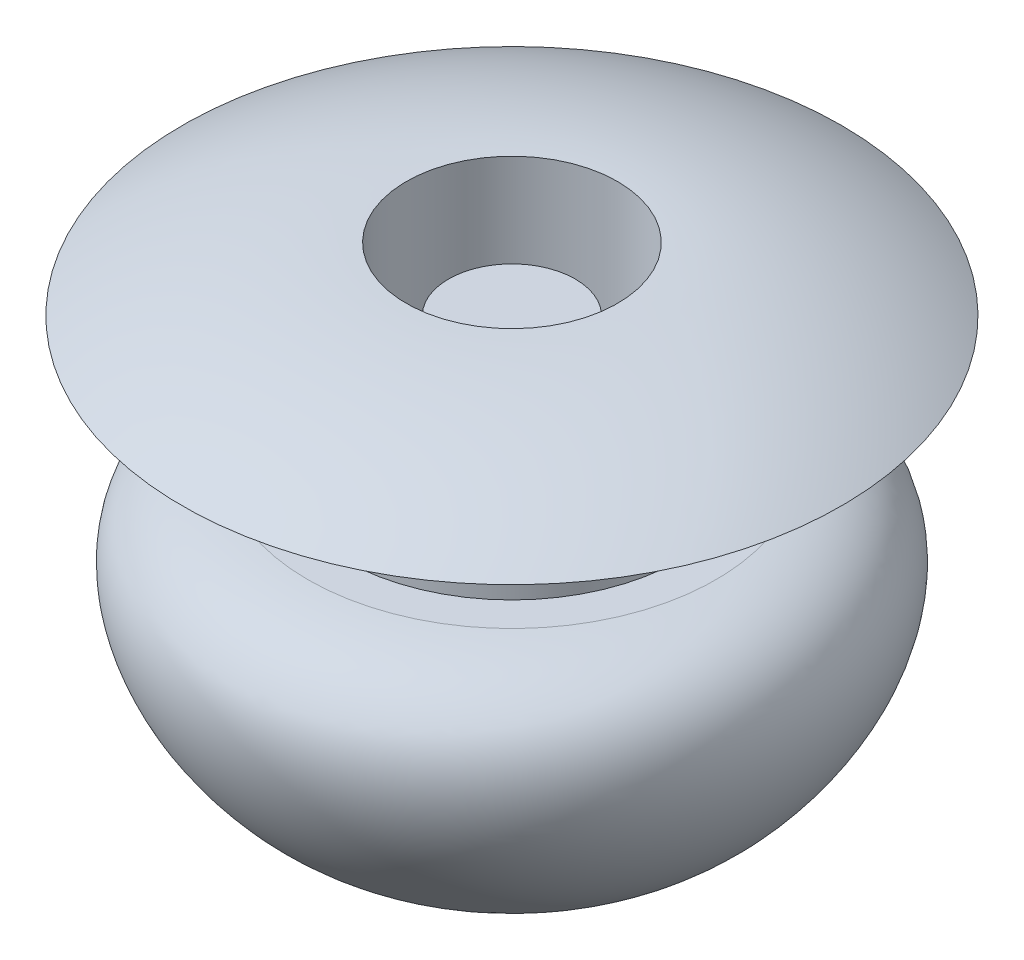
ISO-10303-21;
HEADER;
FILE_DESCRIPTION(('STEP AP214'),'2;1');
FILE_NAME('part.step','',(''),(''),'','','');
FILE_SCHEMA(('AUTOMOTIVE_DESIGN { 1 0 10303 214 1 1 1 1 }'));
ENDSEC;
DATA;
#1=APPLICATION_CONTEXT('core data for automotive mechanical design processes');
#2=APPLICATION_PROTOCOL_DEFINITION('international standard','automotive_design',2000,#1);
#3=PRODUCT_CONTEXT('',#1,'mechanical');
#4=PRODUCT('Part','Part','',(#3));
#5=PRODUCT_RELATED_PRODUCT_CATEGORY('part','',(#4));
#6=PRODUCT_DEFINITION_FORMATION('','',#4);
#7=PRODUCT_DEFINITION_CONTEXT('part definition',#1,'design');
#8=PRODUCT_DEFINITION('design','',#6,#7);
#9=PRODUCT_DEFINITION_SHAPE('','',#8);
#10=(LENGTH_UNIT() NAMED_UNIT(*) SI_UNIT(.MILLI.,.METRE.));
#11=(NAMED_UNIT(*) PLANE_ANGLE_UNIT() SI_UNIT($,.RADIAN.));
#12=(NAMED_UNIT(*) SI_UNIT($,.STERADIAN.) SOLID_ANGLE_UNIT());
#13=UNCERTAINTY_MEASURE_WITH_UNIT(LENGTH_MEASURE(1.E-05),#10,'distance_accuracy_value','');
#14=(GEOMETRIC_REPRESENTATION_CONTEXT(3) GLOBAL_UNCERTAINTY_ASSIGNED_CONTEXT((#13)) GLOBAL_UNIT_ASSIGNED_CONTEXT((#10,
#11,#12)) REPRESENTATION_CONTEXT('',''));
#15=CARTESIAN_POINT('',(0.,0.,0.));
#16=DIRECTION('',(0.,0.,1.));
#17=DIRECTION('',(1.,0.,0.));
#18=AXIS2_PLACEMENT_3D('',#15,#16,#17);
#19=CARTESIAN_POINT('',(0.,0.,0.));
#20=DIRECTION('',(0.,-1.,0.));
#21=DIRECTION('',(0.,0.,-1.));
#22=AXIS2_PLACEMENT_3D('',#19,#20,#21);
#23=PLANE('',#22);
#24=CARTESIAN_POINT('',(0.,0.,0.));
#25=DIRECTION('',(0.,-1.,0.));
#26=DIRECTION('',(0.,0.,-1.));
#27=AXIS2_PLACEMENT_3D('',#24,#25,#26);
#28=CIRCLE('',#27,0.75);
#29=CARTESIAN_POINT('',(0.,0.,-0.75));
#30=VERTEX_POINT('',#29);
#31=EDGE_CURVE('E11',#30,#30,#28,.T.);
#32=ORIENTED_EDGE('',*,*,#31,.F.);
#33=EDGE_LOOP('',(#32));
#34=FACE_BOUND('',#33,.T.);
#35=ADVANCED_FACE('F39',(#34),#23,.F.);
#36=CARTESIAN_POINT('',(0.,0.,0.));
#37=DIRECTION('',(0.,-1.,0.));
#38=DIRECTION('',(0.,0.,-1.));
#39=AXIS2_PLACEMENT_3D('',#36,#37,#38);
#40=CYLINDRICAL_SURFACE('',#39,0.75);
#41=CARTESIAN_POINT('',(0.,-1.70073852298959,0.));
#42=DIRECTION('',(0.,-1.,0.));
#43=DIRECTION('',(0.,0.,-1.));
#44=AXIS2_PLACEMENT_3D('',#41,#42,#43);
#45=CIRCLE('',#44,0.75);
#46=CARTESIAN_POINT('',(0.,-1.70073852298959,-0.75));
#47=VERTEX_POINT('',#46);
#48=EDGE_CURVE('E46',#47,#47,#45,.T.);
#49=ORIENTED_EDGE('',*,*,#48,.F.);
#50=EDGE_LOOP('',(#49));
#51=FACE_BOUND('',#50,.T.);
#52=ORIENTED_EDGE('',*,*,#31,.T.);
#53=EDGE_LOOP('',(#52));
#54=FACE_BOUND('',#53,.T.);
#55=ADVANCED_FACE('F95',(#51,#54),#40,.T.);
#56=CARTESIAN_POINT('',(0.,-1.70073852298959,0.75));
#57=DIRECTION('',(0.,-1.,0.));
#58=DIRECTION('',(0.,0.,-1.));
#59=AXIS2_PLACEMENT_3D('',#56,#57,#58);
#60=PLANE('',#59);
#61=CARTESIAN_POINT('',(0.,-1.70073852298959,0.));
#62=DIRECTION('',(0.,-1.,0.));
#63=DIRECTION('',(0.,0.,-1.));
#64=AXIS2_PLACEMENT_3D('',#61,#62,#63);
#65=CIRCLE('',#64,1.25);
#66=CARTESIAN_POINT('',(0.,-1.70073852298959,-1.25));
#67=VERTEX_POINT('',#66);
#68=EDGE_CURVE('E85',#67,#67,#65,.T.);
#69=ORIENTED_EDGE('',*,*,#68,.F.);
#70=EDGE_LOOP('',(#69));
#71=FACE_BOUND('',#70,.T.);
#72=ORIENTED_EDGE('',*,*,#48,.T.);
#73=EDGE_LOOP('',(#72));
#74=FACE_BOUND('',#73,.T.);
#75=ADVANCED_FACE('F93',(#71,#74),#60,.F.);
#76=CARTESIAN_POINT('',(0.,0.,0.));
#77=DIRECTION('',(0.,-1.,0.));
#78=DIRECTION('',(0.,0.,-1.));
#79=AXIS2_PLACEMENT_3D('',#76,#77,#78);
#80=CYLINDRICAL_SURFACE('',#79,1.25);
#81=CARTESIAN_POINT('',(0.,0.75,0.));
#82=DIRECTION('',(0.,-1.,0.));
#83=DIRECTION('',(0.,0.,-1.));
#84=AXIS2_PLACEMENT_3D('',#81,#82,#83);
#85=CIRCLE('',#84,1.25);
#86=CARTESIAN_POINT('',(0.,0.75,-1.25));
#87=VERTEX_POINT('',#86);
#88=EDGE_CURVE('E81',#87,#87,#85,.T.);
#89=ORIENTED_EDGE('',*,*,#88,.F.);
#90=EDGE_LOOP('',(#89));
#91=FACE_BOUND('',#90,.T.);
#92=ORIENTED_EDGE('',*,*,#68,.T.);
#93=EDGE_LOOP('',(#92));
#94=FACE_BOUND('',#93,.T.);
#95=ADVANCED_FACE('F113',(#91,#94),#80,.F.);
#96=CARTESIAN_POINT('',(0.,-4.30666666666667,0.));
#97=DIRECTION('',(0.,-1.,0.));
#98=DIRECTION('',(0.,0.,-1.));
#99=AXIS2_PLACEMENT_3D('',#96,#97,#98);
#100=DEGENERATE_TOROIDAL_SURFACE('',#99,1.25,5.05666666666667,.T.);
#101=CARTESIAN_POINT('',(0.,0.,0.));
#102=DIRECTION('',(0.,-1.,0.));
#103=DIRECTION('',(0.,0.,-1.));
#104=AXIS2_PLACEMENT_3D('',#101,#102,#103);
#105=CIRCLE('',#104,3.9);
#106=CARTESIAN_POINT('',(0.,0.,-3.9));
#107=VERTEX_POINT('',#106);
#108=EDGE_CURVE('E77',#107,#107,#105,.T.);
#109=ORIENTED_EDGE('',*,*,#108,.F.);
#110=EDGE_LOOP('',(#109));
#111=FACE_BOUND('',#110,.T.);
#112=ORIENTED_EDGE('',*,*,#88,.T.);
#113=EDGE_LOOP('',(#112));
#114=FACE_BOUND('',#113,.T.);
#115=ADVANCED_FACE('F121',(#111,#114),#100,.T.);
#116=CARTESIAN_POINT('',(0.,0.,3.9));
#117=DIRECTION('',(0.,1.,0.));
#118=DIRECTION('',(0.,0.,1.));
#119=AXIS2_PLACEMENT_3D('',#116,#117,#118);
#120=PLANE('',#119);
#121=CARTESIAN_POINT('',(0.,0.,0.));
#122=DIRECTION('',(0.,-1.,0.));
#123=DIRECTION('',(0.,0.,-1.));
#124=AXIS2_PLACEMENT_3D('',#121,#122,#123);
#125=CIRCLE('',#124,2.);
#126=CARTESIAN_POINT('',(0.,0.,-2.));
#127=VERTEX_POINT('',#126);
#128=EDGE_CURVE('E73',#127,#127,#125,.T.);
#129=ORIENTED_EDGE('',*,*,#128,.F.);
#130=EDGE_LOOP('',(#129));
#131=FACE_BOUND('',#130,.T.);
#132=ORIENTED_EDGE('',*,*,#108,.T.);
#133=EDGE_LOOP('',(#132));
#134=FACE_BOUND('',#133,.T.);
#135=ADVANCED_FACE('F129',(#131,#134),#120,.F.);
#136=CARTESIAN_POINT('',(0.,0.,0.));
#137=DIRECTION('',(0.,-1.,0.));
#138=DIRECTION('',(0.,0.,-1.));
#139=AXIS2_PLACEMENT_3D('',#136,#137,#138);
#140=CYLINDRICAL_SURFACE('',#139,2.);
#141=CARTESIAN_POINT('',(0.,-1.49999999999962,0.));
#142=DIRECTION('',(0.,-1.,0.));
#143=DIRECTION('',(0.,0.,-1.));
#144=AXIS2_PLACEMENT_3D('',#141,#142,#143);
#145=CIRCLE('',#144,2.);
#146=CARTESIAN_POINT('',(0.,-1.49999999999962,-2.));
#147=VERTEX_POINT('',#146);
#148=EDGE_CURVE('E64',#147,#147,#145,.T.);
#149=ORIENTED_EDGE('',*,*,#148,.F.);
#150=EDGE_LOOP('',(#149));
#151=FACE_BOUND('',#150,.T.);
#152=ORIENTED_EDGE('',*,*,#128,.T.);
#153=EDGE_LOOP('',(#152));
#154=FACE_BOUND('',#153,.T.);
#155=ADVANCED_FACE('F137',(#151,#154),#140,.T.);
#156=CARTESIAN_POINT('',(0.,-1.49999999999962,2.));
#157=DIRECTION('',(0.,-1.,0.));
#158=DIRECTION('',(0.,0.,-1.));
#159=AXIS2_PLACEMENT_3D('',#156,#157,#158);
#160=PLANE('',#159);
#161=CARTESIAN_POINT('',(0.,-1.49999999999962,0.));
#162=DIRECTION('',(0.,-1.,0.));
#163=DIRECTION('',(0.,0.,-1.));
#164=AXIS2_PLACEMENT_3D('',#161,#162,#163);
#165=CIRCLE('',#164,2.4138917546613);
#166=CARTESIAN_POINT('',(0.,-1.49999999999962,-2.4138917546613));
#167=VERTEX_POINT('',#166);
#168=EDGE_CURVE('E59',#167,#167,#165,.T.);
#169=ORIENTED_EDGE('',*,*,#168,.F.);
#170=EDGE_LOOP('',(#169));
#171=FACE_BOUND('',#170,.T.);
#172=ORIENTED_EDGE('',*,*,#148,.T.);
#173=EDGE_LOOP('',(#172));
#174=FACE_BOUND('',#173,.T.);
#175=ADVANCED_FACE('F145',(#171,#174),#160,.F.);
#176=CARTESIAN_POINT('',(0.,-1.49999999999971,2.4138917546613));
#177=CARTESIAN_POINT('',(0.,-1.66965732172829,3.86750311174021));
#178=CARTESIAN_POINT('',(0.,-3.80201362643808,3.52887764908681));
#179=CARTESIAN_POINT('',(0.,-5.37353236883216,1.08396164238538));
#180=CARTESIAN_POINT('',(0.,-3.37494929761637,0.271752617549606));
#181=CARTESIAN_POINT('',(0.,-3.07892919358036,0.956030426512505));
#182=B_SPLINE_CURVE_WITH_KNOTS('',3,(#176,#177,#178,#179,#180,#181),.UNSPECIFIED.,.F.,.F.,(4,1,
1,4),(0.,0.46499308176492,0.721927552661066,1.),.UNSPECIFIED.);
#183=CARTESIAN_POINT('',(0.,0.,0.));
#184=DIRECTION('',(0.,-1.,0.));
#185=AXIS1_PLACEMENT('',#183,#184);
#186=SURFACE_OF_REVOLUTION('',#182,#185);
#187=CARTESIAN_POINT('',(0.,-3.07892919358036,0.));
#188=DIRECTION('',(0.,-1.,0.));
#189=DIRECTION('',(0.,0.,-1.));
#190=AXIS2_PLACEMENT_3D('',#187,#188,#189);
#191=CIRCLE('',#190,0.956030426512505);
#192=CARTESIAN_POINT('',(0.,-3.07892919358036,-0.956030426512505));
#193=VERTEX_POINT('',#192);
#194=EDGE_CURVE('E56',#193,#193,#191,.T.);
#195=ORIENTED_EDGE('',*,*,#194,.F.);
#196=EDGE_LOOP('',(#195));
#197=FACE_BOUND('',#196,.T.);
#198=ORIENTED_EDGE('',*,*,#168,.T.);
#199=EDGE_LOOP('',(#198));
#200=FACE_BOUND('',#199,.T.);
#201=ADVANCED_FACE('F52',(#197,#200),#186,.T.);
#202=CARTESIAN_POINT('',(0.,-2.45073852298959,0.));
#203=DIRECTION('',(1.,0.,0.));
#204=DIRECTION('',(0.,0.,1.));
#205=AXIS2_PLACEMENT_3D('',#202,#203,#204);
#206=ELLIPSE('',#205,1.75,0.75);
#207=TRIMMED_CURVE('',#206,(PARAMETER_VALUE(-1.5707963267949)),
(PARAMETER_VALUE(1.5707963267949)),.T.,.PARAMETER.);
#208=CARTESIAN_POINT('',(0.,0.,0.));
#209=DIRECTION('',(0.,-1.,0.));
#210=AXIS1_PLACEMENT('',#208,#209);
#211=SURFACE_OF_REVOLUTION('',#207,#210);
#212=CARTESIAN_POINT('',(0.,-3.20073852298959,0.));
#213=VERTEX_POINT('',#212);
#214=VERTEX_LOOP('',#213);
#215=FACE_BOUND('',#214,.T.);
#216=ORIENTED_EDGE('',*,*,#194,.T.);
#217=EDGE_LOOP('',(#216));
#218=FACE_BOUND('',#217,.T.);
#219=ADVANCED_FACE('F49',(#215,#218),#211,.T.);
#220=CLOSED_SHELL('',(#35,#55,#75,#95,#115,#135,#155,#175,#201,#219));
#221=MANIFOLD_SOLID_BREP('B2',#220);
#222=ADVANCED_BREP_SHAPE_REPRESENTATION('',(#18,#221),#14);
#223=SHAPE_DEFINITION_REPRESENTATION(#9,#222);
ENDSEC;
END-ISO-10303-21;
